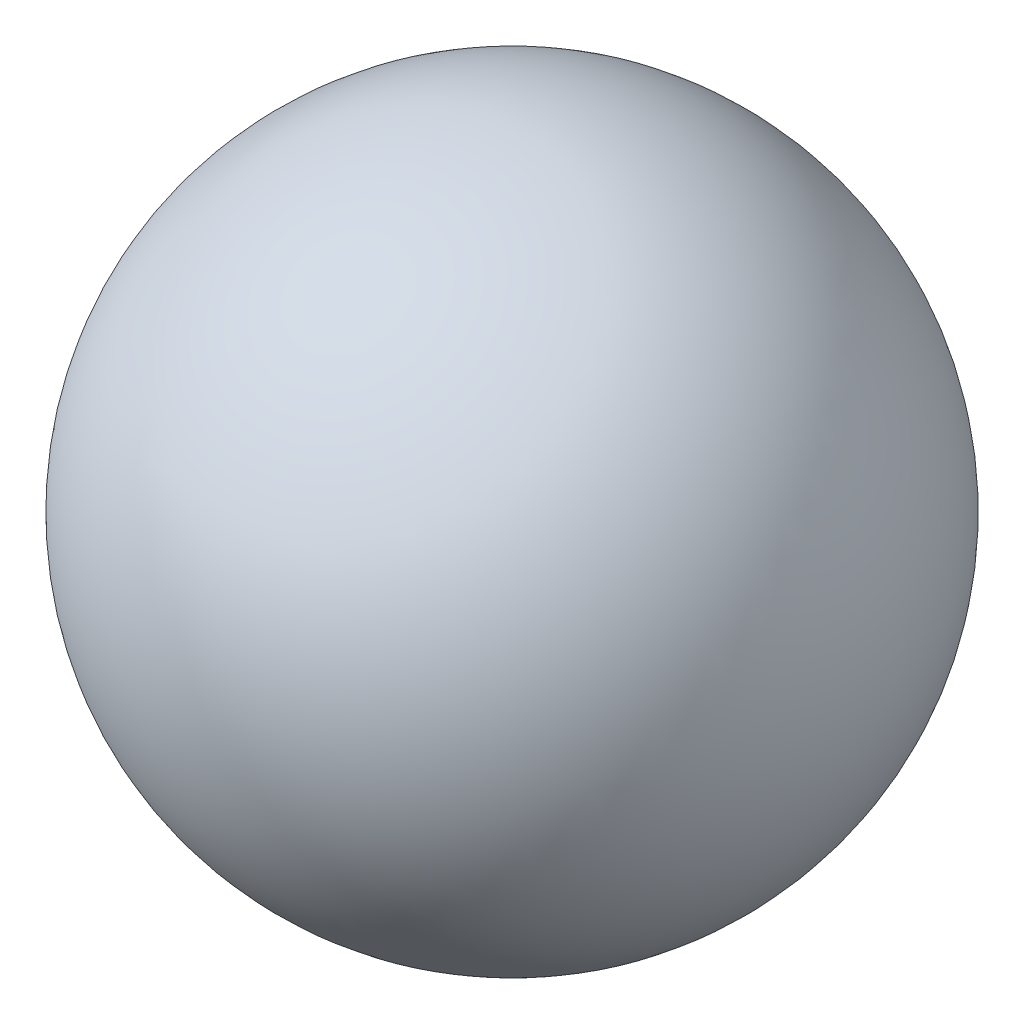
ISO-10303-21;
HEADER;
FILE_DESCRIPTION(('STEP AP214'),'2;1');
FILE_NAME('part.step','',(''),(''),'','','');
FILE_SCHEMA(('AUTOMOTIVE_DESIGN { 1 0 10303 214 1 1 1 1 }'));
ENDSEC;
DATA;
#1=APPLICATION_CONTEXT('core data for automotive mechanical design processes');
#2=APPLICATION_PROTOCOL_DEFINITION('international standard','automotive_design',2000,#1);
#3=PRODUCT_CONTEXT('',#1,'mechanical');
#4=PRODUCT('Part','Part','',(#3));
#5=PRODUCT_RELATED_PRODUCT_CATEGORY('part','',(#4));
#6=PRODUCT_DEFINITION_FORMATION('','',#4);
#7=PRODUCT_DEFINITION_CONTEXT('part definition',#1,'design');
#8=PRODUCT_DEFINITION('design','',#6,#7);
#9=PRODUCT_DEFINITION_SHAPE('','',#8);
#10=(LENGTH_UNIT() NAMED_UNIT(*) SI_UNIT(.MILLI.,.METRE.));
#11=(NAMED_UNIT(*) PLANE_ANGLE_UNIT() SI_UNIT($,.RADIAN.));
#12=(NAMED_UNIT(*) SI_UNIT($,.STERADIAN.) SOLID_ANGLE_UNIT());
#13=UNCERTAINTY_MEASURE_WITH_UNIT(LENGTH_MEASURE(1.E-05),#10,'distance_accuracy_value','');
#14=(GEOMETRIC_REPRESENTATION_CONTEXT(3) GLOBAL_UNCERTAINTY_ASSIGNED_CONTEXT((#13)) GLOBAL_UNIT_ASSIGNED_CONTEXT((#10,
#11,#12)) REPRESENTATION_CONTEXT('',''));
#15=CARTESIAN_POINT('',(0.,0.,0.));
#16=DIRECTION('',(0.,0.,1.));
#17=DIRECTION('',(1.,0.,0.));
#18=AXIS2_PLACEMENT_3D('',#15,#16,#17);
#19=CARTESIAN_POINT('',(0.,0.,0.));
#20=DIRECTION('',(0.,1.,0.));
#21=DIRECTION('',(1.,0.,0.));
#22=AXIS2_PLACEMENT_3D('',#19,#20,#21);
#23=SPHERICAL_SURFACE('',#22,28.56);
#24=CARTESIAN_POINT('',(0.,28.56,0.));
#25=VERTEX_POINT('',#24);
#26=VERTEX_LOOP('',#25);
#27=FACE_BOUND('',#26,.T.);
#28=ADVANCED_FACE('F35',(#27),#23,.T.);
#29=CLOSED_SHELL('',(#28));
#30=MANIFOLD_SOLID_BREP('B2',#29);
#31=ADVANCED_BREP_SHAPE_REPRESENTATION('',(#18,#30),#14);
#32=SHAPE_DEFINITION_REPRESENTATION(#9,#31);
ENDSEC;
END-ISO-10303-21;
